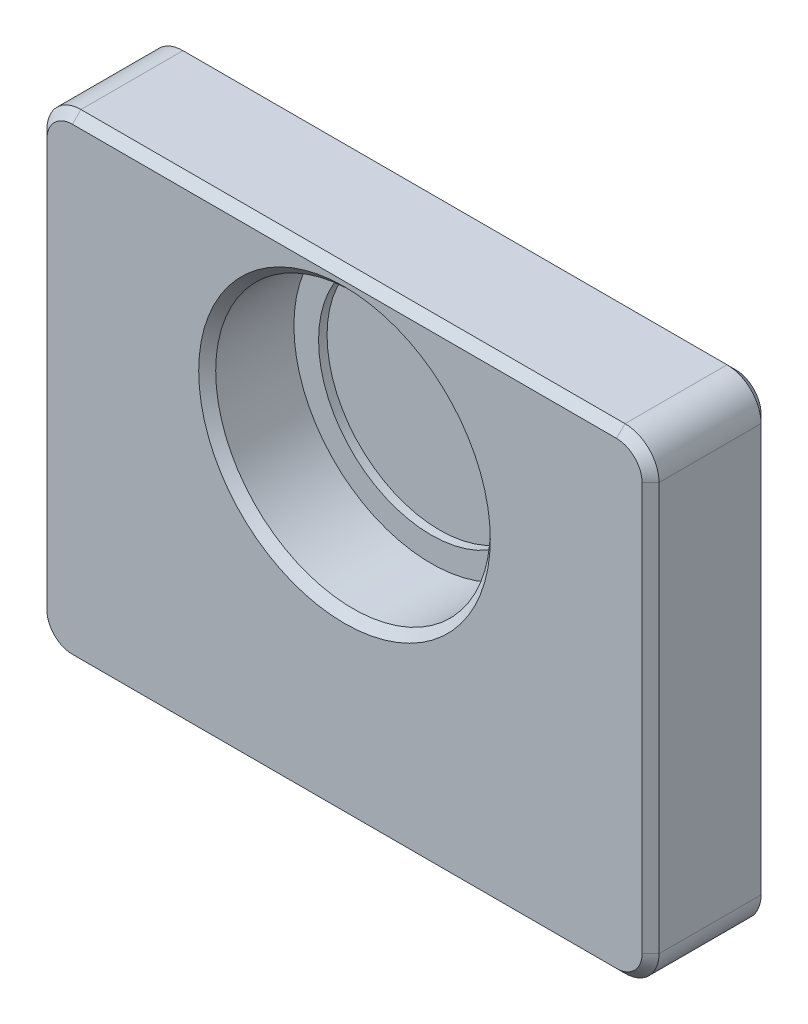
ISO-10303-21;
HEADER;
FILE_DESCRIPTION(('STEP AP214'),'2;1');
FILE_NAME('part.step','',(''),(''),'','','');
FILE_SCHEMA(('AUTOMOTIVE_DESIGN { 1 0 10303 214 1 1 1 1 }'));
ENDSEC;
DATA;
#1=APPLICATION_CONTEXT('core data for automotive mechanical design processes');
#2=APPLICATION_PROTOCOL_DEFINITION('international standard','automotive_design',2000,#1);
#3=PRODUCT_CONTEXT('',#1,'mechanical');
#4=PRODUCT('Part','Part','',(#3));
#5=PRODUCT_RELATED_PRODUCT_CATEGORY('part','',(#4));
#6=PRODUCT_DEFINITION_FORMATION('','',#4);
#7=PRODUCT_DEFINITION_CONTEXT('part definition',#1,'design');
#8=PRODUCT_DEFINITION('design','',#6,#7);
#9=PRODUCT_DEFINITION_SHAPE('','',#8);
#10=(LENGTH_UNIT() NAMED_UNIT(*) SI_UNIT(.MILLI.,.METRE.));
#11=(NAMED_UNIT(*) PLANE_ANGLE_UNIT() SI_UNIT($,.RADIAN.));
#12=(NAMED_UNIT(*) SI_UNIT($,.STERADIAN.) SOLID_ANGLE_UNIT());
#13=UNCERTAINTY_MEASURE_WITH_UNIT(LENGTH_MEASURE(1.E-05),#10,'distance_accuracy_value','');
#14=(GEOMETRIC_REPRESENTATION_CONTEXT(3) GLOBAL_UNCERTAINTY_ASSIGNED_CONTEXT((#13)) GLOBAL_UNIT_ASSIGNED_CONTEXT((#10,
#11,#12)) REPRESENTATION_CONTEXT('',''));
#15=CARTESIAN_POINT('',(0.,0.,0.));
#16=DIRECTION('',(0.,0.,1.));
#17=DIRECTION('',(1.,0.,0.));
#18=AXIS2_PLACEMENT_3D('',#15,#16,#17);
#19=CARTESIAN_POINT('',(18.,-14.,7.));
#20=DIRECTION('',(-1.,0.,0.));
#21=DIRECTION('',(0.,0.,1.));
#22=AXIS2_PLACEMENT_3D('',#19,#20,#21);
#23=PLANE('',#22);
#24=DIRECTION('',(0.,0.,-1.));
#25=VECTOR('',#24,1.);
#26=CARTESIAN_POINT('',(18.,12.,7.));
#27=LINE('',#26,#25);
#28=CARTESIAN_POINT('',(18.,12.,0.500000000000007));
#29=VERTEX_POINT('',#28);
#30=CARTESIAN_POINT('',(18.,12.,6.50000000000001));
#31=VERTEX_POINT('',#30);
#32=EDGE_CURVE('E301',#29,#31,#27,.F.);
#33=ORIENTED_EDGE('',*,*,#32,.T.);
#34=DIRECTION('',(0.,-1.,0.));
#35=VECTOR('',#34,1.);
#36=CARTESIAN_POINT('',(18.,-12.,6.50000000000001));
#37=LINE('',#36,#35);
#38=CARTESIAN_POINT('',(18.,-12.,6.50000000000001));
#39=VERTEX_POINT('',#38);
#40=EDGE_CURVE('E221',#31,#39,#37,.T.);
#41=ORIENTED_EDGE('',*,*,#40,.T.);
#42=DIRECTION('',(0.,0.,-1.));
#43=VECTOR('',#42,1.);
#44=CARTESIAN_POINT('',(18.,-12.,7.));
#45=LINE('',#44,#43);
#46=CARTESIAN_POINT('',(18.,-12.,0.500000000000007));
#47=VERTEX_POINT('',#46);
#48=EDGE_CURVE('E294',#39,#47,#45,.T.);
#49=ORIENTED_EDGE('',*,*,#48,.T.);
#50=DIRECTION('',(0.,1.,0.));
#51=VECTOR('',#50,1.);
#52=CARTESIAN_POINT('',(18.,-14.,0.500000000000007));
#53=LINE('',#52,#51);
#54=EDGE_CURVE('E219',#47,#29,#53,.T.);
#55=ORIENTED_EDGE('',*,*,#54,.T.);
#56=EDGE_LOOP('',(#33,#41,#49,#55));
#57=FACE_BOUND('',#56,.T.);
#58=ADVANCED_FACE('F38',(#57),#23,.F.);
#59=CARTESIAN_POINT('',(18.,14.,7.));
#60=DIRECTION('',(0.,-1.,0.));
#61=DIRECTION('',(1.,0.,0.));
#62=AXIS2_PLACEMENT_3D('',#59,#60,#61);
#63=PLANE('',#62);
#64=DIRECTION('',(0.,0.,-1.));
#65=VECTOR('',#64,1.);
#66=CARTESIAN_POINT('',(-16.,14.,7.));
#67=LINE('',#66,#65);
#68=CARTESIAN_POINT('',(-16.,14.,0.500000000000007));
#69=VERTEX_POINT('',#68);
#70=CARTESIAN_POINT('',(-16.,14.,6.50000000000001));
#71=VERTEX_POINT('',#70);
#72=EDGE_CURVE('E312',#69,#71,#67,.F.);
#73=ORIENTED_EDGE('',*,*,#72,.T.);
#74=DIRECTION('',(1.,0.,0.));
#75=VECTOR('',#74,1.);
#76=CARTESIAN_POINT('',(16.,14.,6.50000000000001));
#77=LINE('',#76,#75);
#78=CARTESIAN_POINT('',(16.,14.,6.50000000000001));
#79=VERTEX_POINT('',#78);
#80=EDGE_CURVE('E211',#71,#79,#77,.T.);
#81=ORIENTED_EDGE('',*,*,#80,.T.);
#82=DIRECTION('',(0.,0.,-1.));
#83=VECTOR('',#82,1.);
#84=CARTESIAN_POINT('',(16.,14.,7.));
#85=LINE('',#84,#83);
#86=CARTESIAN_POINT('',(16.,14.,0.500000000000007));
#87=VERTEX_POINT('',#86);
#88=EDGE_CURVE('E302',#79,#87,#85,.T.);
#89=ORIENTED_EDGE('',*,*,#88,.T.);
#90=DIRECTION('',(-1.,0.,0.));
#91=VECTOR('',#90,1.);
#92=CARTESIAN_POINT('',(18.,14.,0.500000000000007));
#93=LINE('',#92,#91);
#94=EDGE_CURVE('E208',#87,#69,#93,.T.);
#95=ORIENTED_EDGE('',*,*,#94,.T.);
#96=EDGE_LOOP('',(#73,#81,#89,#95));
#97=FACE_BOUND('',#96,.T.);
#98=ADVANCED_FACE('F377',(#97),#63,.F.);
#99=CARTESIAN_POINT('',(-18.,-14.,7.));
#100=DIRECTION('',(1.,0.,0.));
#101=DIRECTION('',(0.,0.,-1.));
#102=AXIS2_PLACEMENT_3D('',#99,#100,#101);
#103=PLANE('',#102);
#104=DIRECTION('',(0.,0.,-1.));
#105=VECTOR('',#104,1.);
#106=CARTESIAN_POINT('',(-18.,-12.,7.));
#107=LINE('',#106,#105);
#108=CARTESIAN_POINT('',(-18.,-12.,0.500000000000007));
#109=VERTEX_POINT('',#108);
#110=CARTESIAN_POINT('',(-18.,-12.,6.50000000000001));
#111=VERTEX_POINT('',#110);
#112=EDGE_CURVE('E320',#109,#111,#107,.F.);
#113=ORIENTED_EDGE('',*,*,#112,.T.);
#114=DIRECTION('',(0.,1.,0.));
#115=VECTOR('',#114,1.);
#116=CARTESIAN_POINT('',(-18.,12.,6.50000000000001));
#117=LINE('',#116,#115);
#118=CARTESIAN_POINT('',(-18.,12.,6.50000000000001));
#119=VERTEX_POINT('',#118);
#120=EDGE_CURVE('E200',#111,#119,#117,.T.);
#121=ORIENTED_EDGE('',*,*,#120,.T.);
#122=DIRECTION('',(0.,0.,-1.));
#123=VECTOR('',#122,1.);
#124=CARTESIAN_POINT('',(-18.,12.,7.));
#125=LINE('',#124,#123);
#126=CARTESIAN_POINT('',(-18.,12.,0.500000000000007));
#127=VERTEX_POINT('',#126);
#128=EDGE_CURVE('E323',#119,#127,#125,.T.);
#129=ORIENTED_EDGE('',*,*,#128,.T.);
#130=DIRECTION('',(0.,-1.,0.));
#131=VECTOR('',#130,1.);
#132=CARTESIAN_POINT('',(-18.,-14.,0.500000000000007));
#133=LINE('',#132,#131);
#134=EDGE_CURVE('E198',#127,#109,#133,.T.);
#135=ORIENTED_EDGE('',*,*,#134,.T.);
#136=EDGE_LOOP('',(#113,#121,#129,#135));
#137=FACE_BOUND('',#136,.T.);
#138=ADVANCED_FACE('F414',(#137),#103,.F.);
#139=CARTESIAN_POINT('',(-18.,-14.,7.));
#140=DIRECTION('',(0.,1.,0.));
#141=DIRECTION('',(0.,0.,1.));
#142=AXIS2_PLACEMENT_3D('',#139,#140,#141);
#143=PLANE('',#142);
#144=CARTESIAN_POINT('',(0.,-14.,3.5));
#145=DIRECTION('',(0.,-1.,0.));
#146=DIRECTION('',(0.,0.,-1.));
#147=AXIS2_PLACEMENT_3D('',#144,#145,#146);
#148=CIRCLE('',#147,2.2);
#149=CARTESIAN_POINT('',(0.,-14.,1.3));
#150=VERTEX_POINT('',#149);
#151=EDGE_CURVE('E257',#150,#150,#148,.T.);
#152=ORIENTED_EDGE('',*,*,#151,.F.);
#153=EDGE_LOOP('',(#152));
#154=FACE_BOUND('',#153,.T.);
#155=DIRECTION('',(0.,0.,-1.));
#156=VECTOR('',#155,1.);
#157=CARTESIAN_POINT('',(16.,-14.,7.));
#158=LINE('',#157,#156);
#159=CARTESIAN_POINT('',(16.,-14.,0.500000000000007));
#160=VERTEX_POINT('',#159);
#161=CARTESIAN_POINT('',(16.,-14.,6.50000000000001));
#162=VERTEX_POINT('',#161);
#163=EDGE_CURVE('E296',#160,#162,#158,.F.);
#164=ORIENTED_EDGE('',*,*,#163,.T.);
#165=DIRECTION('',(-1.,0.,0.));
#166=VECTOR('',#165,1.);
#167=CARTESIAN_POINT('',(-16.,-14.,6.50000000000001));
#168=LINE('',#167,#166);
#169=CARTESIAN_POINT('',(-16.,-14.,6.50000000000001));
#170=VERTEX_POINT('',#169);
#171=EDGE_CURVE('E191',#162,#170,#168,.T.);
#172=ORIENTED_EDGE('',*,*,#171,.T.);
#173=DIRECTION('',(0.,0.,-1.));
#174=VECTOR('',#173,1.);
#175=CARTESIAN_POINT('',(-16.,-14.,7.));
#176=LINE('',#175,#174);
#177=CARTESIAN_POINT('',(-16.,-14.,0.500000000000007));
#178=VERTEX_POINT('',#177);
#179=EDGE_CURVE('E308',#170,#178,#176,.T.);
#180=ORIENTED_EDGE('',*,*,#179,.T.);
#181=DIRECTION('',(1.,0.,0.));
#182=VECTOR('',#181,1.);
#183=CARTESIAN_POINT('',(-18.,-14.,0.500000000000007));
#184=LINE('',#183,#182);
#185=EDGE_CURVE('E188',#178,#160,#184,.T.);
#186=ORIENTED_EDGE('',*,*,#185,.T.);
#187=EDGE_LOOP('',(#164,#172,#180,#186));
#188=FACE_BOUND('',#187,.T.);
#189=ADVANCED_FACE('F348',(#154,#188),#143,.F.);
#190=CARTESIAN_POINT('',(0.,0.,7.));
#191=DIRECTION('',(0.,0.,1.));
#192=DIRECTION('',(1.,0.,0.));
#193=AXIS2_PLACEMENT_3D('',#190,#191,#192);
#194=PLANE('',#193);
#195=DIRECTION('',(1.,0.,0.));
#196=VECTOR('',#195,1.);
#197=CARTESIAN_POINT('',(16.,-13.5,7.));
#198=LINE('',#197,#196);
#199=CARTESIAN_POINT('',(-16.,-13.5,7.));
#200=VERTEX_POINT('',#199);
#201=CARTESIAN_POINT('',(16.,-13.5,7.));
#202=VERTEX_POINT('',#201);
#203=EDGE_CURVE('E177',#200,#202,#198,.T.);
#204=ORIENTED_EDGE('',*,*,#203,.T.);
#205=CARTESIAN_POINT('',(16.,-12.,7.));
#206=DIRECTION('',(0.,0.,1.));
#207=DIRECTION('',(1.,0.,0.));
#208=AXIS2_PLACEMENT_3D('',#205,#206,#207);
#209=CIRCLE('',#208,1.50000000000002);
#210=CARTESIAN_POINT('',(17.5,-12.,7.));
#211=VERTEX_POINT('',#210);
#212=EDGE_CURVE('E157',#202,#211,#209,.T.);
#213=ORIENTED_EDGE('',*,*,#212,.T.);
#214=DIRECTION('',(0.,1.,0.));
#215=VECTOR('',#214,1.);
#216=CARTESIAN_POINT('',(17.5,12.,7.));
#217=LINE('',#216,#215);
#218=CARTESIAN_POINT('',(17.5,12.,7.));
#219=VERTEX_POINT('',#218);
#220=EDGE_CURVE('E165',#211,#219,#217,.T.);
#221=ORIENTED_EDGE('',*,*,#220,.T.);
#222=CARTESIAN_POINT('',(16.,12.,7.));
#223=DIRECTION('',(0.,0.,1.));
#224=DIRECTION('',(1.,0.,0.));
#225=AXIS2_PLACEMENT_3D('',#222,#223,#224);
#226=CIRCLE('',#225,1.50000000000002);
#227=CARTESIAN_POINT('',(16.,13.5,7.));
#228=VERTEX_POINT('',#227);
#229=EDGE_CURVE('E171',#219,#228,#226,.T.);
#230=ORIENTED_EDGE('',*,*,#229,.T.);
#231=DIRECTION('',(-1.,0.,0.));
#232=VECTOR('',#231,1.);
#233=CARTESIAN_POINT('',(-16.,13.5,7.));
#234=LINE('',#233,#232);
#235=CARTESIAN_POINT('',(-16.,13.5,7.));
#236=VERTEX_POINT('',#235);
#237=EDGE_CURVE('E330',#228,#236,#234,.T.);
#238=ORIENTED_EDGE('',*,*,#237,.T.);
#239=CARTESIAN_POINT('',(-16.,12.,7.));
#240=DIRECTION('',(0.,0.,1.));
#241=DIRECTION('',(1.,0.,0.));
#242=AXIS2_PLACEMENT_3D('',#239,#240,#241);
#243=CIRCLE('',#242,1.50000000000001);
#244=CARTESIAN_POINT('',(-17.5,12.,7.));
#245=VERTEX_POINT('',#244);
#246=EDGE_CURVE('E333',#236,#245,#243,.T.);
#247=ORIENTED_EDGE('',*,*,#246,.T.);
#248=DIRECTION('',(0.,-1.,0.));
#249=VECTOR('',#248,1.);
#250=CARTESIAN_POINT('',(-17.5,-12.,7.));
#251=LINE('',#250,#249);
#252=CARTESIAN_POINT('',(-17.5,-12.,7.));
#253=VERTEX_POINT('',#252);
#254=EDGE_CURVE('E335',#245,#253,#251,.T.);
#255=ORIENTED_EDGE('',*,*,#254,.T.);
#256=CARTESIAN_POINT('',(-16.,-12.,7.));
#257=DIRECTION('',(0.,0.,1.));
#258=DIRECTION('',(1.,0.,0.));
#259=AXIS2_PLACEMENT_3D('',#256,#257,#258);
#260=CIRCLE('',#259,1.50000000000001);
#261=EDGE_CURVE('E183',#253,#200,#260,.T.);
#262=ORIENTED_EDGE('',*,*,#261,.T.);
#263=EDGE_LOOP('',(#204,#213,#221,#230,#238,#247,#255,#262));
#264=FACE_BOUND('',#263,.T.);
#265=CARTESIAN_POINT('',(0.,4.65000000000001,7.));
#266=DIRECTION('',(0.,0.,1.));
#267=DIRECTION('',(1.,0.,0.));
#268=AXIS2_PLACEMENT_3D('',#265,#266,#267);
#269=CIRCLE('',#268,8.575);
#270=CARTESIAN_POINT('',(8.575,4.65000000000001,7.));
#271=VERTEX_POINT('',#270);
#272=EDGE_CURVE('E172',#271,#271,#269,.F.);
#273=ORIENTED_EDGE('',*,*,#272,.T.);
#274=EDGE_LOOP('',(#273));
#275=FACE_BOUND('',#274,.T.);
#276=ADVANCED_FACE('F174',(#264,#275),#194,.T.);
#277=CARTESIAN_POINT('',(0.,0.,0.));
#278=DIRECTION('',(0.,0.,1.));
#279=DIRECTION('',(1.,0.,0.));
#280=AXIS2_PLACEMENT_3D('',#277,#278,#279);
#281=PLANE('',#280);
#282=DIRECTION('',(0.,1.,0.));
#283=VECTOR('',#282,1.);
#284=CARTESIAN_POINT('',(-17.5,0.,0.));
#285=LINE('',#284,#283);
#286=CARTESIAN_POINT('',(-17.5,-12.,0.));
#287=VERTEX_POINT('',#286);
#288=CARTESIAN_POINT('',(-17.5,12.,0.));
#289=VERTEX_POINT('',#288);
#290=EDGE_CURVE('E48',#287,#289,#285,.T.);
#291=ORIENTED_EDGE('',*,*,#290,.T.);
#292=CARTESIAN_POINT('',(-16.,12.,0.));
#293=DIRECTION('',(0.,0.,1.));
#294=DIRECTION('',(1.,0.,0.));
#295=AXIS2_PLACEMENT_3D('',#292,#293,#294);
#296=CIRCLE('',#295,1.49999999999999);
#297=CARTESIAN_POINT('',(-16.,13.5,0.));
#298=VERTEX_POINT('',#297);
#299=EDGE_CURVE('E11',#289,#298,#296,.F.);
#300=ORIENTED_EDGE('',*,*,#299,.T.);
#301=DIRECTION('',(1.,0.,0.));
#302=VECTOR('',#301,1.);
#303=CARTESIAN_POINT('',(0.,13.5,0.));
#304=LINE('',#303,#302);
#305=CARTESIAN_POINT('',(16.,13.5,0.));
#306=VERTEX_POINT('',#305);
#307=EDGE_CURVE('E226',#298,#306,#304,.T.);
#308=ORIENTED_EDGE('',*,*,#307,.T.);
#309=CARTESIAN_POINT('',(16.,12.,0.));
#310=DIRECTION('',(0.,0.,1.));
#311=DIRECTION('',(1.,0.,0.));
#312=AXIS2_PLACEMENT_3D('',#309,#310,#311);
#313=CIRCLE('',#312,1.49999999999999);
#314=CARTESIAN_POINT('',(17.5,12.,0.));
#315=VERTEX_POINT('',#314);
#316=EDGE_CURVE('E229',#306,#315,#313,.F.);
#317=ORIENTED_EDGE('',*,*,#316,.T.);
#318=DIRECTION('',(0.,-1.,0.));
#319=VECTOR('',#318,1.);
#320=CARTESIAN_POINT('',(17.5,0.,0.));
#321=LINE('',#320,#319);
#322=CARTESIAN_POINT('',(17.5,-12.,0.));
#323=VERTEX_POINT('',#322);
#324=EDGE_CURVE('E231',#315,#323,#321,.T.);
#325=ORIENTED_EDGE('',*,*,#324,.T.);
#326=CARTESIAN_POINT('',(16.,-12.,0.));
#327=DIRECTION('',(0.,0.,1.));
#328=DIRECTION('',(1.,0.,0.));
#329=AXIS2_PLACEMENT_3D('',#326,#327,#328);
#330=CIRCLE('',#329,1.49999999999999);
#331=CARTESIAN_POINT('',(16.,-13.5,0.));
#332=VERTEX_POINT('',#331);
#333=EDGE_CURVE('E233',#323,#332,#330,.F.);
#334=ORIENTED_EDGE('',*,*,#333,.T.);
#335=DIRECTION('',(-1.,0.,0.));
#336=VECTOR('',#335,1.);
#337=CARTESIAN_POINT('',(0.,-13.5,0.));
#338=LINE('',#337,#336);
#339=CARTESIAN_POINT('',(-16.,-13.5,0.));
#340=VERTEX_POINT('',#339);
#341=EDGE_CURVE('E235',#332,#340,#338,.T.);
#342=ORIENTED_EDGE('',*,*,#341,.T.);
#343=CARTESIAN_POINT('',(-16.,-12.,0.));
#344=DIRECTION('',(0.,0.,1.));
#345=DIRECTION('',(1.,0.,0.));
#346=AXIS2_PLACEMENT_3D('',#343,#344,#345);
#347=CIRCLE('',#346,1.49999999999999);
#348=EDGE_CURVE('E59',#340,#287,#347,.F.);
#349=ORIENTED_EDGE('',*,*,#348,.T.);
#350=EDGE_LOOP('',(#291,#300,#308,#317,#325,#334,#342,#349));
#351=FACE_BOUND('',#350,.T.);
#352=ADVANCED_FACE('F364',(#351),#281,.F.);
#353=CARTESIAN_POINT('',(0.,4.65000000000001,1.4));
#354=DIRECTION('',(0.,0.,1.));
#355=DIRECTION('',(1.,0.,0.));
#356=AXIS2_PLACEMENT_3D('',#353,#354,#355);
#357=CYLINDRICAL_SURFACE('',#356,8.075);
#358=CARTESIAN_POINT('',(0.,4.65000000000001,6.5));
#359=DIRECTION('',(0.,0.,1.));
#360=DIRECTION('',(1.,0.,0.));
#361=AXIS2_PLACEMENT_3D('',#358,#359,#360);
#362=CIRCLE('',#361,8.075);
#363=CARTESIAN_POINT('',(8.075,4.65000000000001,6.5));
#364=VERTEX_POINT('',#363);
#365=EDGE_CURVE('E223',#364,#364,#362,.T.);
#366=ORIENTED_EDGE('',*,*,#365,.T.);
#367=EDGE_LOOP('',(#366));
#368=FACE_BOUND('',#367,.T.);
#369=CARTESIAN_POINT('',(0.,4.65000000000001,1.9));
#370=DIRECTION('',(0.,0.,1.));
#371=DIRECTION('',(1.,0.,0.));
#372=AXIS2_PLACEMENT_3D('',#369,#370,#371);
#373=CIRCLE('',#372,8.075);
#374=CARTESIAN_POINT('',(8.075,4.65000000000001,1.9));
#375=VERTEX_POINT('',#374);
#376=EDGE_CURVE('E387',#375,#375,#373,.T.);
#377=ORIENTED_EDGE('',*,*,#376,.F.);
#378=EDGE_LOOP('',(#377));
#379=FACE_BOUND('',#378,.T.);
#380=ADVANCED_FACE('F621',(#368,#379),#357,.F.);
#381=CARTESIAN_POINT('',(0.,4.65000000000001,1.9));
#382=DIRECTION('',(0.,0.,1.));
#383=DIRECTION('',(1.,0.,0.));
#384=AXIS2_PLACEMENT_3D('',#381,#382,#383);
#385=PLANE('',#384);
#386=ORIENTED_EDGE('',*,*,#376,.T.);
#387=EDGE_LOOP('',(#386));
#388=FACE_BOUND('',#387,.T.);
#389=CARTESIAN_POINT('',(0.,4.65000000000001,1.9));
#390=DIRECTION('',(0.,0.,1.));
#391=DIRECTION('',(1.,0.,0.));
#392=AXIS2_PLACEMENT_3D('',#389,#390,#391);
#393=CIRCLE('',#392,6.625);
#394=CARTESIAN_POINT('',(6.625,4.65000000000001,1.9));
#395=VERTEX_POINT('',#394);
#396=EDGE_CURVE('E393',#395,#395,#393,.T.);
#397=ORIENTED_EDGE('',*,*,#396,.F.);
#398=EDGE_LOOP('',(#397));
#399=FACE_BOUND('',#398,.T.);
#400=ADVANCED_FACE('F613',(#388,#399),#385,.T.);
#401=CARTESIAN_POINT('',(0.,4.65000000000001,1.9));
#402=DIRECTION('',(0.,0.,-1.));
#403=DIRECTION('',(-1.,0.,0.));
#404=AXIS2_PLACEMENT_3D('',#401,#402,#403);
#405=CYLINDRICAL_SURFACE('',#404,6.625);
#406=ORIENTED_EDGE('',*,*,#396,.T.);
#407=EDGE_LOOP('',(#406));
#408=FACE_BOUND('',#407,.T.);
#409=CARTESIAN_POINT('',(0.,4.65000000000001,1.4));
#410=DIRECTION('',(0.,0.,1.));
#411=DIRECTION('',(1.,0.,0.));
#412=AXIS2_PLACEMENT_3D('',#409,#410,#411);
#413=CIRCLE('',#412,6.625);
#414=CARTESIAN_POINT('',(6.625,4.65000000000001,1.4));
#415=VERTEX_POINT('',#414);
#416=EDGE_CURVE('E384',#415,#415,#413,.F.);
#417=ORIENTED_EDGE('',*,*,#416,.T.);
#418=EDGE_LOOP('',(#417));
#419=FACE_BOUND('',#418,.T.);
#420=ADVANCED_FACE('F605',(#408,#419),#405,.F.);
#421=CARTESIAN_POINT('',(0.,4.65000000000001,1.4));
#422=DIRECTION('',(0.,0.,1.));
#423=DIRECTION('',(1.,0.,0.));
#424=AXIS2_PLACEMENT_3D('',#421,#422,#423);
#425=PLANE('',#424);
#426=ORIENTED_EDGE('',*,*,#416,.F.);
#427=EDGE_LOOP('',(#426));
#428=FACE_BOUND('',#427,.T.);
#429=ADVANCED_FACE('F433',(#428),#425,.T.);
#430=CARTESIAN_POINT('',(16.,12.,7.));
#431=DIRECTION('',(0.,0.,-1.));
#432=DIRECTION('',(-1.,0.,0.));
#433=AXIS2_PLACEMENT_3D('',#430,#431,#432);
#434=CYLINDRICAL_SURFACE('',#433,2.);
#435=ORIENTED_EDGE('',*,*,#88,.F.);
#436=CARTESIAN_POINT('',(16.,12.,6.50000000000001));
#437=DIRECTION('',(0.,0.,1.));
#438=DIRECTION('',(1.,0.,0.));
#439=AXIS2_PLACEMENT_3D('',#436,#437,#438);
#440=CIRCLE('',#439,2.);
#441=EDGE_CURVE('E217',#79,#31,#440,.F.);
#442=ORIENTED_EDGE('',*,*,#441,.T.);
#443=ORIENTED_EDGE('',*,*,#32,.F.);
#444=CARTESIAN_POINT('',(16.,12.,0.500000000000007));
#445=DIRECTION('',(0.,0.,1.));
#446=DIRECTION('',(1.,0.,0.));
#447=AXIS2_PLACEMENT_3D('',#444,#445,#446);
#448=CIRCLE('',#447,2.);
#449=EDGE_CURVE('E214',#29,#87,#448,.T.);
#450=ORIENTED_EDGE('',*,*,#449,.T.);
#451=EDGE_LOOP('',(#435,#442,#443,#450));
#452=FACE_BOUND('',#451,.T.);
#453=ADVANCED_FACE('F430',(#452),#434,.T.);
#454=CARTESIAN_POINT('',(16.,-12.,7.));
#455=DIRECTION('',(0.,0.,-1.));
#456=DIRECTION('',(-1.,0.,0.));
#457=AXIS2_PLACEMENT_3D('',#454,#455,#456);
#458=CYLINDRICAL_SURFACE('',#457,2.);
#459=ORIENTED_EDGE('',*,*,#48,.F.);
#460=CARTESIAN_POINT('',(16.,-12.,6.50000000000001));
#461=DIRECTION('',(0.,0.,1.));
#462=DIRECTION('',(1.,0.,0.));
#463=AXIS2_PLACEMENT_3D('',#460,#461,#462);
#464=CIRCLE('',#463,2.);
#465=EDGE_CURVE('E159',#39,#162,#464,.F.);
#466=ORIENTED_EDGE('',*,*,#465,.T.);
#467=ORIENTED_EDGE('',*,*,#163,.F.);
#468=CARTESIAN_POINT('',(16.,-12.,0.500000000000007));
#469=DIRECTION('',(0.,0.,1.));
#470=DIRECTION('',(1.,0.,0.));
#471=AXIS2_PLACEMENT_3D('',#468,#469,#470);
#472=CIRCLE('',#471,2.);
#473=EDGE_CURVE('E179',#160,#47,#472,.T.);
#474=ORIENTED_EDGE('',*,*,#473,.T.);
#475=EDGE_LOOP('',(#459,#466,#467,#474));
#476=FACE_BOUND('',#475,.T.);
#477=ADVANCED_FACE('F293',(#476),#458,.T.);
#478=CARTESIAN_POINT('',(-16.,12.,7.));
#479=DIRECTION('',(0.,0.,-1.));
#480=DIRECTION('',(-1.,0.,0.));
#481=AXIS2_PLACEMENT_3D('',#478,#479,#480);
#482=CYLINDRICAL_SURFACE('',#481,2.);
#483=ORIENTED_EDGE('',*,*,#128,.F.);
#484=CARTESIAN_POINT('',(-16.,12.,6.50000000000001));
#485=DIRECTION('',(0.,0.,1.));
#486=DIRECTION('',(1.,0.,0.));
#487=AXIS2_PLACEMENT_3D('',#484,#485,#486);
#488=CIRCLE('',#487,2.);
#489=EDGE_CURVE('E206',#119,#71,#488,.F.);
#490=ORIENTED_EDGE('',*,*,#489,.T.);
#491=ORIENTED_EDGE('',*,*,#72,.F.);
#492=CARTESIAN_POINT('',(-16.,12.,0.500000000000007));
#493=DIRECTION('',(0.,0.,1.));
#494=DIRECTION('',(1.,0.,0.));
#495=AXIS2_PLACEMENT_3D('',#492,#493,#494);
#496=CIRCLE('',#495,2.);
#497=EDGE_CURVE('E203',#69,#127,#496,.T.);
#498=ORIENTED_EDGE('',*,*,#497,.T.);
#499=EDGE_LOOP('',(#483,#490,#491,#498));
#500=FACE_BOUND('',#499,.T.);
#501=ADVANCED_FACE('F382',(#500),#482,.T.);
#502=CARTESIAN_POINT('',(-16.,-12.,7.));
#503=DIRECTION('',(0.,0.,-1.));
#504=DIRECTION('',(-1.,0.,0.));
#505=AXIS2_PLACEMENT_3D('',#502,#503,#504);
#506=CYLINDRICAL_SURFACE('',#505,2.);
#507=ORIENTED_EDGE('',*,*,#179,.F.);
#508=CARTESIAN_POINT('',(-16.,-12.,6.50000000000001));
#509=DIRECTION('',(0.,0.,1.));
#510=DIRECTION('',(1.,0.,0.));
#511=AXIS2_PLACEMENT_3D('',#508,#509,#510);
#512=CIRCLE('',#511,2.);
#513=EDGE_CURVE('E196',#170,#111,#512,.F.);
#514=ORIENTED_EDGE('',*,*,#513,.T.);
#515=ORIENTED_EDGE('',*,*,#112,.F.);
#516=CARTESIAN_POINT('',(-16.,-12.,0.500000000000007));
#517=DIRECTION('',(0.,0.,1.));
#518=DIRECTION('',(1.,0.,0.));
#519=AXIS2_PLACEMENT_3D('',#516,#517,#518);
#520=CIRCLE('',#519,2.);
#521=EDGE_CURVE('E194',#109,#178,#520,.T.);
#522=ORIENTED_EDGE('',*,*,#521,.T.);
#523=EDGE_LOOP('',(#507,#514,#515,#522));
#524=FACE_BOUND('',#523,.T.);
#525=ADVANCED_FACE('F350',(#524),#506,.T.);
#526=CARTESIAN_POINT('',(0.,-5.99999999999999,3.5));
#527=DIRECTION('',(0.,-1.,0.));
#528=DIRECTION('',(0.,0.,-1.));
#529=AXIS2_PLACEMENT_3D('',#526,#527,#528);
#530=CYLINDRICAL_SURFACE('',#529,2.2);
#531=CARTESIAN_POINT('',(0.,-5.99999999999999,3.5));
#532=DIRECTION('',(0.,-1.,0.));
#533=DIRECTION('',(0.,0.,-1.));
#534=AXIS2_PLACEMENT_3D('',#531,#532,#533);
#535=CIRCLE('',#534,2.2);
#536=CARTESIAN_POINT('',(0.,-5.99999999999999,1.3));
#537=VERTEX_POINT('',#536);
#538=EDGE_CURVE('E396',#537,#537,#535,.T.);
#539=ORIENTED_EDGE('',*,*,#538,.F.);
#540=EDGE_LOOP('',(#539));
#541=FACE_BOUND('',#540,.T.);
#542=ORIENTED_EDGE('',*,*,#151,.T.);
#543=EDGE_LOOP('',(#542));
#544=FACE_BOUND('',#543,.T.);
#545=ADVANCED_FACE('F407',(#541,#544),#530,.F.);
#546=CARTESIAN_POINT('',(0.,-5.99999999999999,3.5));
#547=DIRECTION('',(0.,-1.,0.));
#548=DIRECTION('',(0.,0.,-1.));
#549=AXIS2_PLACEMENT_3D('',#546,#547,#548);
#550=PLANE('',#549);
#551=ORIENTED_EDGE('',*,*,#538,.T.);
#552=EDGE_LOOP('',(#551));
#553=FACE_BOUND('',#552,.T.);
#554=ADVANCED_FACE('F405',(#553),#550,.T.);
#555=CARTESIAN_POINT('',(-16.,12.,7.));
#556=DIRECTION('',(0.,0.,-1.));
#557=DIRECTION('',(-1.,0.,0.));
#558=AXIS2_PLACEMENT_3D('',#555,#556,#557);
#559=CONICAL_SURFACE('',#558,1.50000000000001,0.785398163397441);
#560=DIRECTION('',(0.,-0.707106781186544,0.707106781186551));
#561=VECTOR('',#560,1.);
#562=CARTESIAN_POINT('',(-16.,14.,6.50000000000001));
#563=LINE('',#562,#561);
#564=EDGE_CURVE('E251',#71,#236,#563,.T.);
#565=ORIENTED_EDGE('',*,*,#564,.F.);
#566=ORIENTED_EDGE('',*,*,#489,.F.);
#567=DIRECTION('',(-0.707106781186543,0.,-0.707106781186552));
#568=VECTOR('',#567,1.);
#569=CARTESIAN_POINT('',(-17.5,12.,7.));
#570=LINE('',#569,#568);
#571=EDGE_CURVE('E254',#245,#119,#570,.T.);
#572=ORIENTED_EDGE('',*,*,#571,.F.);
#573=ORIENTED_EDGE('',*,*,#246,.F.);
#574=EDGE_LOOP('',(#565,#566,#572,#573));
#575=FACE_BOUND('',#574,.T.);
#576=ADVANCED_FACE('F484',(#575),#559,.T.);
#577=CARTESIAN_POINT('',(-17.5,0.,7.));
#578=DIRECTION('',(-0.707106781186552,0.,0.707106781186543));
#579=DIRECTION('',(0.,1.,0.));
#580=AXIS2_PLACEMENT_3D('',#577,#578,#579);
#581=PLANE('',#580);
#582=ORIENTED_EDGE('',*,*,#571,.T.);
#583=ORIENTED_EDGE('',*,*,#120,.F.);
#584=DIRECTION('',(-0.707106781186543,0.,-0.707106781186552));
#585=VECTOR('',#584,1.);
#586=CARTESIAN_POINT('',(-17.5,-12.,7.));
#587=LINE('',#586,#585);
#588=EDGE_CURVE('E248',#253,#111,#587,.T.);
#589=ORIENTED_EDGE('',*,*,#588,.F.);
#590=ORIENTED_EDGE('',*,*,#254,.F.);
#591=EDGE_LOOP('',(#582,#583,#589,#590));
#592=FACE_BOUND('',#591,.T.);
#593=ADVANCED_FACE('F477',(#592),#581,.T.);
#594=CARTESIAN_POINT('',(0.,13.5,7.));
#595=DIRECTION('',(0.,0.707106781186552,0.707106781186543));
#596=DIRECTION('',(1.,0.,0.));
#597=AXIS2_PLACEMENT_3D('',#594,#595,#596);
#598=PLANE('',#597);
#599=ORIENTED_EDGE('',*,*,#564,.T.);
#600=ORIENTED_EDGE('',*,*,#237,.F.);
#601=DIRECTION('',(0.,-0.707106781186543,0.707106781186552));
#602=VECTOR('',#601,1.);
#603=CARTESIAN_POINT('',(16.,14.,6.50000000000001));
#604=LINE('',#603,#602);
#605=EDGE_CURVE('E245',#79,#228,#604,.T.);
#606=ORIENTED_EDGE('',*,*,#605,.F.);
#607=ORIENTED_EDGE('',*,*,#80,.F.);
#608=EDGE_LOOP('',(#599,#600,#606,#607));
#609=FACE_BOUND('',#608,.T.);
#610=ADVANCED_FACE('F471',(#609),#598,.T.);
#611=CARTESIAN_POINT('',(-16.,-12.,7.));
#612=DIRECTION('',(0.,0.,-1.));
#613=DIRECTION('',(-1.,0.,0.));
#614=AXIS2_PLACEMENT_3D('',#611,#612,#613);
#615=CONICAL_SURFACE('',#614,1.50000000000001,0.785398163397443);
#616=ORIENTED_EDGE('',*,*,#588,.T.);
#617=ORIENTED_EDGE('',*,*,#513,.F.);
#618=DIRECTION('',(0.,-0.707106781186544,-0.707106781186551));
#619=VECTOR('',#618,1.);
#620=CARTESIAN_POINT('',(-16.,-13.5,7.));
#621=LINE('',#620,#619);
#622=EDGE_CURVE('E242',#200,#170,#621,.T.);
#623=ORIENTED_EDGE('',*,*,#622,.F.);
#624=ORIENTED_EDGE('',*,*,#261,.F.);
#625=EDGE_LOOP('',(#616,#617,#623,#624));
#626=FACE_BOUND('',#625,.T.);
#627=ADVANCED_FACE('F342',(#626),#615,.T.);
#628=CARTESIAN_POINT('',(16.,12.,7.));
#629=DIRECTION('',(0.,0.,-1.));
#630=DIRECTION('',(-1.,0.,0.));
#631=AXIS2_PLACEMENT_3D('',#628,#629,#630);
#632=CONICAL_SURFACE('',#631,1.50000000000002,0.78539816339744);
#633=ORIENTED_EDGE('',*,*,#605,.T.);
#634=ORIENTED_EDGE('',*,*,#229,.F.);
#635=DIRECTION('',(-0.707106781186543,0.,0.707106781186552));
#636=VECTOR('',#635,1.);
#637=CARTESIAN_POINT('',(18.,12.,6.50000000000001));
#638=LINE('',#637,#636);
#639=EDGE_CURVE('E168',#31,#219,#638,.T.);
#640=ORIENTED_EDGE('',*,*,#639,.F.);
#641=ORIENTED_EDGE('',*,*,#441,.F.);
#642=EDGE_LOOP('',(#633,#634,#640,#641));
#643=FACE_BOUND('',#642,.T.);
#644=ADVANCED_FACE('F459',(#643),#632,.T.);
#645=CARTESIAN_POINT('',(0.,-13.5,7.));
#646=DIRECTION('',(0.,-0.707106781186552,0.707106781186543));
#647=DIRECTION('',(-1.,0.,0.));
#648=AXIS2_PLACEMENT_3D('',#645,#646,#647);
#649=PLANE('',#648);
#650=ORIENTED_EDGE('',*,*,#622,.T.);
#651=ORIENTED_EDGE('',*,*,#171,.F.);
#652=DIRECTION('',(0.,-0.707106781186543,-0.707106781186552));
#653=VECTOR('',#652,1.);
#654=CARTESIAN_POINT('',(16.,-13.5,7.));
#655=LINE('',#654,#653);
#656=EDGE_CURVE('E162',#202,#162,#655,.T.);
#657=ORIENTED_EDGE('',*,*,#656,.F.);
#658=ORIENTED_EDGE('',*,*,#203,.F.);
#659=EDGE_LOOP('',(#650,#651,#657,#658));
#660=FACE_BOUND('',#659,.T.);
#661=ADVANCED_FACE('F345',(#660),#649,.T.);
#662=CARTESIAN_POINT('',(17.5,0.,7.));
#663=DIRECTION('',(0.707106781186552,0.,0.707106781186543));
#664=DIRECTION('',(0.,-1.,0.));
#665=AXIS2_PLACEMENT_3D('',#662,#663,#664);
#666=PLANE('',#665);
#667=ORIENTED_EDGE('',*,*,#639,.T.);
#668=ORIENTED_EDGE('',*,*,#220,.F.);
#669=DIRECTION('',(-0.707106781186543,0.,0.707106781186552));
#670=VECTOR('',#669,1.);
#671=CARTESIAN_POINT('',(18.,-12.,6.50000000000001));
#672=LINE('',#671,#670);
#673=EDGE_CURVE('E153',#39,#211,#672,.T.);
#674=ORIENTED_EDGE('',*,*,#673,.F.);
#675=ORIENTED_EDGE('',*,*,#40,.F.);
#676=EDGE_LOOP('',(#667,#668,#674,#675));
#677=FACE_BOUND('',#676,.T.);
#678=ADVANCED_FACE('F166',(#677),#666,.T.);
#679=CARTESIAN_POINT('',(16.,-12.,7.));
#680=DIRECTION('',(0.,0.,-1.));
#681=DIRECTION('',(-1.,0.,0.));
#682=AXIS2_PLACEMENT_3D('',#679,#680,#681);
#683=CONICAL_SURFACE('',#682,1.50000000000001,0.785398163397441);
#684=ORIENTED_EDGE('',*,*,#656,.T.);
#685=ORIENTED_EDGE('',*,*,#465,.F.);
#686=ORIENTED_EDGE('',*,*,#673,.T.);
#687=ORIENTED_EDGE('',*,*,#212,.F.);
#688=EDGE_LOOP('',(#684,#685,#686,#687));
#689=FACE_BOUND('',#688,.T.);
#690=ADVANCED_FACE('F155',(#689),#683,.T.);
#691=CARTESIAN_POINT('',(0.,4.65000000000001,6.5));
#692=DIRECTION('',(0.,0.,1.));
#693=DIRECTION('',(1.,0.,0.));
#694=AXIS2_PLACEMENT_3D('',#691,#692,#693);
#695=CONICAL_SURFACE('',#694,8.075,0.785398163397448);
#696=ORIENTED_EDGE('',*,*,#272,.F.);
#697=EDGE_LOOP('',(#696));
#698=FACE_BOUND('',#697,.T.);
#699=ORIENTED_EDGE('',*,*,#365,.F.);
#700=EDGE_LOOP('',(#699));
#701=FACE_BOUND('',#700,.T.);
#702=ADVANCED_FACE('F448',(#698,#701),#695,.F.);
#703=CARTESIAN_POINT('',(16.,-12.,0.));
#704=DIRECTION('',(0.,0.,1.));
#705=DIRECTION('',(1.,0.,0.));
#706=AXIS2_PLACEMENT_3D('',#703,#704,#705);
#707=CONICAL_SURFACE('',#706,1.49999999999999,0.785398163397448);
#708=DIRECTION('',(-0.707106781186547,0.,-0.707106781186547));
#709=VECTOR('',#708,1.);
#710=CARTESIAN_POINT('',(18.,-12.,0.500000000000007));
#711=LINE('',#710,#709);
#712=EDGE_CURVE('E273',#47,#323,#711,.T.);
#713=ORIENTED_EDGE('',*,*,#712,.F.);
#714=ORIENTED_EDGE('',*,*,#473,.F.);
#715=DIRECTION('',(0.,-0.707106781186547,0.707106781186547));
#716=VECTOR('',#715,1.);
#717=CARTESIAN_POINT('',(16.,-13.5,0.));
#718=LINE('',#717,#716);
#719=EDGE_CURVE('E43',#332,#160,#718,.T.);
#720=ORIENTED_EDGE('',*,*,#719,.F.);
#721=ORIENTED_EDGE('',*,*,#333,.F.);
#722=EDGE_LOOP('',(#713,#714,#720,#721));
#723=FACE_BOUND('',#722,.T.);
#724=ADVANCED_FACE('F41',(#723),#707,.T.);
#725=CARTESIAN_POINT('',(-18.,-14.,0.500000000000007));
#726=DIRECTION('',(0.,0.707106781186547,0.707106781186547));
#727=DIRECTION('',(1.,0.,0.));
#728=AXIS2_PLACEMENT_3D('',#725,#726,#727);
#729=PLANE('',#728);
#730=ORIENTED_EDGE('',*,*,#719,.T.);
#731=ORIENTED_EDGE('',*,*,#185,.F.);
#732=DIRECTION('',(0.,-0.707106781186547,0.707106781186547));
#733=VECTOR('',#732,1.);
#734=CARTESIAN_POINT('',(-16.,-13.5,0.));
#735=LINE('',#734,#733);
#736=EDGE_CURVE('E271',#340,#178,#735,.T.);
#737=ORIENTED_EDGE('',*,*,#736,.F.);
#738=ORIENTED_EDGE('',*,*,#341,.F.);
#739=EDGE_LOOP('',(#730,#731,#737,#738));
#740=FACE_BOUND('',#739,.T.);
#741=ADVANCED_FACE('F284',(#740),#729,.F.);
#742=CARTESIAN_POINT('',(18.,-14.,0.500000000000007));
#743=DIRECTION('',(-0.707106781186547,0.,0.707106781186547));
#744=DIRECTION('',(0.,1.,0.));
#745=AXIS2_PLACEMENT_3D('',#742,#743,#744);
#746=PLANE('',#745);
#747=ORIENTED_EDGE('',*,*,#712,.T.);
#748=ORIENTED_EDGE('',*,*,#324,.F.);
#749=DIRECTION('',(-0.707106781186547,0.,-0.707106781186547));
#750=VECTOR('',#749,1.);
#751=CARTESIAN_POINT('',(18.,12.,0.500000000000007));
#752=LINE('',#751,#750);
#753=EDGE_CURVE('E268',#29,#315,#752,.T.);
#754=ORIENTED_EDGE('',*,*,#753,.F.);
#755=ORIENTED_EDGE('',*,*,#54,.F.);
#756=EDGE_LOOP('',(#747,#748,#754,#755));
#757=FACE_BOUND('',#756,.T.);
#758=ADVANCED_FACE('F522',(#757),#746,.F.);
#759=CARTESIAN_POINT('',(-16.,-12.,0.));
#760=DIRECTION('',(0.,0.,1.));
#761=DIRECTION('',(1.,0.,0.));
#762=AXIS2_PLACEMENT_3D('',#759,#760,#761);
#763=CONICAL_SURFACE('',#762,1.49999999999999,0.78539816339745);
#764=ORIENTED_EDGE('',*,*,#736,.T.);
#765=ORIENTED_EDGE('',*,*,#521,.F.);
#766=DIRECTION('',(-0.707106781186547,0.,0.707106781186547));
#767=VECTOR('',#766,1.);
#768=CARTESIAN_POINT('',(-17.5,-12.,0.));
#769=LINE('',#768,#767);
#770=EDGE_CURVE('E265',#287,#109,#769,.T.);
#771=ORIENTED_EDGE('',*,*,#770,.F.);
#772=ORIENTED_EDGE('',*,*,#348,.F.);
#773=EDGE_LOOP('',(#764,#765,#771,#772));
#774=FACE_BOUND('',#773,.T.);
#775=ADVANCED_FACE('F354',(#774),#763,.T.);
#776=CARTESIAN_POINT('',(16.,12.,0.));
#777=DIRECTION('',(0.,0.,1.));
#778=DIRECTION('',(1.,0.,0.));
#779=AXIS2_PLACEMENT_3D('',#776,#777,#778);
#780=CONICAL_SURFACE('',#779,1.49999999999999,0.785398163397447);
#781=ORIENTED_EDGE('',*,*,#753,.T.);
#782=ORIENTED_EDGE('',*,*,#316,.F.);
#783=DIRECTION('',(0.,-0.707106781186546,-0.707106781186549));
#784=VECTOR('',#783,1.);
#785=CARTESIAN_POINT('',(16.,14.,0.500000000000007));
#786=LINE('',#785,#784);
#787=EDGE_CURVE('E262',#87,#306,#786,.T.);
#788=ORIENTED_EDGE('',*,*,#787,.F.);
#789=ORIENTED_EDGE('',*,*,#449,.F.);
#790=EDGE_LOOP('',(#781,#782,#788,#789));
#791=FACE_BOUND('',#790,.T.);
#792=ADVANCED_FACE('F369',(#791),#780,.T.);
#793=CARTESIAN_POINT('',(-18.,-14.,0.500000000000007));
#794=DIRECTION('',(0.707106781186547,0.,0.707106781186547));
#795=DIRECTION('',(0.,-1.,0.));
#796=AXIS2_PLACEMENT_3D('',#793,#794,#795);
#797=PLANE('',#796);
#798=ORIENTED_EDGE('',*,*,#770,.T.);
#799=ORIENTED_EDGE('',*,*,#134,.F.);
#800=DIRECTION('',(-0.707106781186547,0.,0.707106781186547));
#801=VECTOR('',#800,1.);
#802=CARTESIAN_POINT('',(-17.5,12.,0.));
#803=LINE('',#802,#801);
#804=EDGE_CURVE('E260',#289,#127,#803,.T.);
#805=ORIENTED_EDGE('',*,*,#804,.F.);
#806=ORIENTED_EDGE('',*,*,#290,.F.);
#807=EDGE_LOOP('',(#798,#799,#805,#806));
#808=FACE_BOUND('',#807,.T.);
#809=ADVANCED_FACE('F357',(#808),#797,.F.);
#810=CARTESIAN_POINT('',(18.,14.,0.500000000000007));
#811=DIRECTION('',(0.,-0.707106781186547,0.707106781186548));
#812=DIRECTION('',(-1.,0.,0.));
#813=AXIS2_PLACEMENT_3D('',#810,#811,#812);
#814=PLANE('',#813);
#815=ORIENTED_EDGE('',*,*,#787,.T.);
#816=ORIENTED_EDGE('',*,*,#307,.F.);
#817=DIRECTION('',(0.,-0.707106781186549,-0.707106781186546));
#818=VECTOR('',#817,1.);
#819=CARTESIAN_POINT('',(-16.,14.,0.500000000000007));
#820=LINE('',#819,#818);
#821=EDGE_CURVE('E258',#69,#298,#820,.T.);
#822=ORIENTED_EDGE('',*,*,#821,.F.);
#823=ORIENTED_EDGE('',*,*,#94,.F.);
#824=EDGE_LOOP('',(#815,#816,#822,#823));
#825=FACE_BOUND('',#824,.T.);
#826=ADVANCED_FACE('F373',(#825),#814,.F.);
#827=CARTESIAN_POINT('',(-16.,12.,0.));
#828=DIRECTION('',(0.,0.,1.));
#829=DIRECTION('',(1.,0.,0.));
#830=AXIS2_PLACEMENT_3D('',#827,#828,#829);
#831=CONICAL_SURFACE('',#830,1.49999999999999,0.785398163397448);
#832=ORIENTED_EDGE('',*,*,#804,.T.);
#833=ORIENTED_EDGE('',*,*,#497,.F.);
#834=ORIENTED_EDGE('',*,*,#821,.T.);
#835=ORIENTED_EDGE('',*,*,#299,.F.);
#836=EDGE_LOOP('',(#832,#833,#834,#835));
#837=FACE_BOUND('',#836,.T.);
#838=ADVANCED_FACE('F361',(#837),#831,.T.);
#839=CLOSED_SHELL('',(#58,#98,#138,#189,#276,#352,#380,#400,#420,#429,#453,#477,#501,#525,#545,
#554,#576,#593,#610,#627,#644,#661,#678,#690,#702,#724,#741,#758,#775,#792,#809,#826,#838));
#840=MANIFOLD_SOLID_BREP('B2',#839);
#841=ADVANCED_BREP_SHAPE_REPRESENTATION('',(#18,#840),#14);
#842=SHAPE_DEFINITION_REPRESENTATION(#9,#841);
ENDSEC;
END-ISO-10303-21;
